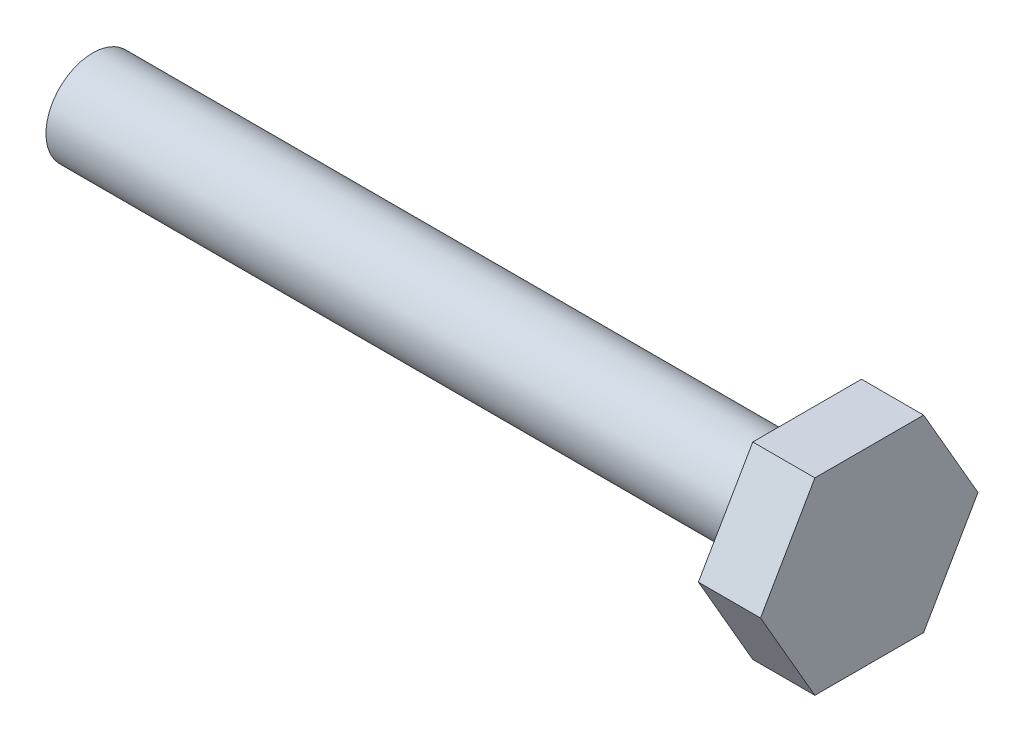
ISO-10303-21;
HEADER;
FILE_DESCRIPTION(('STEP AP214'),'2;1');
FILE_NAME('part.step','',(''),(''),'','','');
FILE_SCHEMA(('AUTOMOTIVE_DESIGN { 1 0 10303 214 1 1 1 1 }'));
ENDSEC;
DATA;
#1=APPLICATION_CONTEXT('core data for automotive mechanical design processes');
#2=APPLICATION_PROTOCOL_DEFINITION('international standard','automotive_design',2000,#1);
#3=PRODUCT_CONTEXT('',#1,'mechanical');
#4=PRODUCT('Part','Part','',(#3));
#5=PRODUCT_RELATED_PRODUCT_CATEGORY('part','',(#4));
#6=PRODUCT_DEFINITION_FORMATION('','',#4);
#7=PRODUCT_DEFINITION_CONTEXT('part definition',#1,'design');
#8=PRODUCT_DEFINITION('design','',#6,#7);
#9=PRODUCT_DEFINITION_SHAPE('','',#8);
#10=(LENGTH_UNIT() NAMED_UNIT(*) SI_UNIT(.MILLI.,.METRE.));
#11=(NAMED_UNIT(*) PLANE_ANGLE_UNIT() SI_UNIT($,.RADIAN.));
#12=(NAMED_UNIT(*) SI_UNIT($,.STERADIAN.) SOLID_ANGLE_UNIT());
#13=UNCERTAINTY_MEASURE_WITH_UNIT(LENGTH_MEASURE(1.E-05),#10,'distance_accuracy_value','');
#14=(GEOMETRIC_REPRESENTATION_CONTEXT(3) GLOBAL_UNCERTAINTY_ASSIGNED_CONTEXT((#13)) GLOBAL_UNIT_ASSIGNED_CONTEXT((#10,
#11,#12)) REPRESENTATION_CONTEXT('',''));
#15=CARTESIAN_POINT('',(0.,0.,0.));
#16=DIRECTION('',(0.,0.,1.));
#17=DIRECTION('',(1.,0.,0.));
#18=AXIS2_PLACEMENT_3D('',#15,#16,#17);
#19=CARTESIAN_POINT('',(0.,7.,0.));
#20=DIRECTION('',(-1.,0.,0.));
#21=DIRECTION('',(0.,-1.,0.));
#22=AXIS2_PLACEMENT_3D('',#19,#20,#21);
#23=PLANE('',#22);
#24=DIRECTION('',(0.,-0.866025403784435,-0.500000000000007));
#25=VECTOR('',#24,1.);
#26=CARTESIAN_POINT('',(0.,-3.03108891324558,5.24999999999997));
#27=LINE('',#26,#25);
#28=CARTESIAN_POINT('',(0.,0.,7.));
#29=VERTEX_POINT('',#28);
#30=CARTESIAN_POINT('',(0.,-6.0621778264911,3.49999999999994));
#31=VERTEX_POINT('',#30);
#32=EDGE_CURVE('E118',#29,#31,#27,.T.);
#33=ORIENTED_EDGE('',*,*,#32,.T.);
#34=DIRECTION('',(0.,0.,-1.));
#35=VECTOR('',#34,1.);
#36=CARTESIAN_POINT('',(0.,-6.06217782649107,0.));
#37=LINE('',#36,#35);
#38=CARTESIAN_POINT('',(0.,-6.06217782649103,-3.50000000000007));
#39=VERTEX_POINT('',#38);
#40=EDGE_CURVE('E128',#31,#39,#37,.T.);
#41=ORIENTED_EDGE('',*,*,#40,.T.);
#42=DIRECTION('',(0.,0.866025403784442,-0.499999999999995));
#43=VECTOR('',#42,1.);
#44=CARTESIAN_POINT('',(0.,-3.03108891324551,-5.25000000000004));
#45=LINE('',#44,#43);
#46=CARTESIAN_POINT('',(0.,0.,-7.));
#47=VERTEX_POINT('',#46);
#48=EDGE_CURVE('E180',#39,#47,#45,.T.);
#49=ORIENTED_EDGE('',*,*,#48,.T.);
#50=DIRECTION('',(0.,0.866025403784438,0.500000000000001));
#51=VECTOR('',#50,1.);
#52=CARTESIAN_POINT('',(0.,3.03108891324554,-5.24999999999999));
#53=LINE('',#52,#51);
#54=CARTESIAN_POINT('',(0.,6.06217782649108,-3.49999999999999));
#55=VERTEX_POINT('',#54);
#56=EDGE_CURVE('E175',#47,#55,#53,.T.);
#57=ORIENTED_EDGE('',*,*,#56,.T.);
#58=DIRECTION('',(0.,0.,1.));
#59=VECTOR('',#58,1.);
#60=CARTESIAN_POINT('',(0.,6.06217782649107,0.));
#61=LINE('',#60,#59);
#62=CARTESIAN_POINT('',(0.,6.06217782649105,3.50000000000003));
#63=VERTEX_POINT('',#62);
#64=EDGE_CURVE('E189',#55,#63,#61,.T.);
#65=ORIENTED_EDGE('',*,*,#64,.T.);
#66=DIRECTION('',(0.,-0.866025403784442,0.499999999999995));
#67=VECTOR('',#66,1.);
#68=CARTESIAN_POINT('',(0.,3.0310889132455,5.25000000000001));
#69=LINE('',#68,#67);
#70=EDGE_CURVE('E136',#63,#29,#69,.T.);
#71=ORIENTED_EDGE('',*,*,#70,.T.);
#72=EDGE_LOOP('',(#33,#41,#49,#57,#65,#71));
#73=FACE_BOUND('',#72,.T.);
#74=ADVANCED_FACE('F63',(#73),#23,.F.);
#75=CARTESIAN_POINT('',(-4.,2.99999999999999,0.));
#76=DIRECTION('',(1.,0.,0.));
#77=DIRECTION('',(0.,1.,0.));
#78=AXIS2_PLACEMENT_3D('',#75,#76,#77);
#79=PLANE('',#78);
#80=CARTESIAN_POINT('',(-4.,0.,0.));
#81=DIRECTION('',(1.,0.,0.));
#82=DIRECTION('',(0.,1.,0.));
#83=AXIS2_PLACEMENT_3D('',#80,#81,#82);
#84=CIRCLE('',#83,2.99999999999999);
#85=CARTESIAN_POINT('',(-4.,2.99999999999999,0.));
#86=VERTEX_POINT('',#85);
#87=EDGE_CURVE('E71',#86,#86,#84,.T.);
#88=ORIENTED_EDGE('',*,*,#87,.T.);
#89=EDGE_LOOP('',(#88));
#90=FACE_BOUND('',#89,.T.);
#91=DIRECTION('',(0.,0.866025403784435,0.500000000000007));
#92=VECTOR('',#91,1.);
#93=CARTESIAN_POINT('',(-4.,-3.03108891324558,5.24999999999997));
#94=LINE('',#93,#92);
#95=CARTESIAN_POINT('',(-4.,-6.06217782649111,3.49999999999994));
#96=VERTEX_POINT('',#95);
#97=CARTESIAN_POINT('',(-4.,0.,7.));
#98=VERTEX_POINT('',#97);
#99=EDGE_CURVE('E121',#96,#98,#94,.T.);
#100=ORIENTED_EDGE('',*,*,#99,.T.);
#101=DIRECTION('',(0.,0.866025403784442,-0.499999999999995));
#102=VECTOR('',#101,1.);
#103=CARTESIAN_POINT('',(-4.,3.0310889132455,5.25000000000001));
#104=LINE('',#103,#102);
#105=CARTESIAN_POINT('',(-4.,6.06217782649105,3.50000000000003));
#106=VERTEX_POINT('',#105);
#107=EDGE_CURVE('E151',#98,#106,#104,.T.);
#108=ORIENTED_EDGE('',*,*,#107,.T.);
#109=DIRECTION('',(0.,0.,-1.));
#110=VECTOR('',#109,1.);
#111=CARTESIAN_POINT('',(-4.,6.06217782649107,0.));
#112=LINE('',#111,#110);
#113=CARTESIAN_POINT('',(-4.,6.06217782649108,-3.49999999999999));
#114=VERTEX_POINT('',#113);
#115=EDGE_CURVE('E86',#106,#114,#112,.T.);
#116=ORIENTED_EDGE('',*,*,#115,.T.);
#117=DIRECTION('',(0.,-0.866025403784438,-0.500000000000001));
#118=VECTOR('',#117,1.);
#119=CARTESIAN_POINT('',(-4.,3.03108891324554,-5.24999999999999));
#120=LINE('',#119,#118);
#121=CARTESIAN_POINT('',(-4.,0.,-7.));
#122=VERTEX_POINT('',#121);
#123=EDGE_CURVE('E167',#114,#122,#120,.T.);
#124=ORIENTED_EDGE('',*,*,#123,.T.);
#125=DIRECTION('',(0.,-0.866025403784442,0.499999999999995));
#126=VECTOR('',#125,1.);
#127=CARTESIAN_POINT('',(-4.,-3.03108891324552,-5.25000000000004));
#128=LINE('',#127,#126);
#129=CARTESIAN_POINT('',(-4.,-6.06217782649103,-3.50000000000007));
#130=VERTEX_POINT('',#129);
#131=EDGE_CURVE('E78',#122,#130,#128,.T.);
#132=ORIENTED_EDGE('',*,*,#131,.T.);
#133=DIRECTION('',(0.,0.,1.));
#134=VECTOR('',#133,1.);
#135=CARTESIAN_POINT('',(-4.,-6.06217782649107,0.));
#136=LINE('',#135,#134);
#137=EDGE_CURVE('E127',#130,#96,#136,.T.);
#138=ORIENTED_EDGE('',*,*,#137,.T.);
#139=EDGE_LOOP('',(#100,#108,#116,#124,#132,#138));
#140=FACE_BOUND('',#139,.T.);
#141=ADVANCED_FACE('F197',(#90,#140),#79,.F.);
#142=CARTESIAN_POINT('',(-50.,0.,0.));
#143=DIRECTION('',(1.,0.,0.));
#144=DIRECTION('',(0.,1.,0.));
#145=AXIS2_PLACEMENT_3D('',#142,#143,#144);
#146=PLANE('',#145);
#147=CARTESIAN_POINT('',(-50.,0.,0.));
#148=DIRECTION('',(1.,0.,0.));
#149=DIRECTION('',(0.,1.,0.));
#150=AXIS2_PLACEMENT_3D('',#147,#148,#149);
#151=CIRCLE('',#150,3.);
#152=CARTESIAN_POINT('',(-50.,2.99999999999999,0.));
#153=VERTEX_POINT('',#152);
#154=EDGE_CURVE('E12',#153,#153,#151,.T.);
#155=ORIENTED_EDGE('',*,*,#154,.F.);
#156=EDGE_LOOP('',(#155));
#157=FACE_BOUND('',#156,.T.);
#158=ADVANCED_FACE('F213',(#157),#146,.F.);
#159=CARTESIAN_POINT('',(0.,0.,0.));
#160=DIRECTION('',(1.,0.,0.));
#161=DIRECTION('',(0.,1.,0.));
#162=AXIS2_PLACEMENT_3D('',#159,#160,#161);
#163=CYLINDRICAL_SURFACE('',#162,3.);
#164=ORIENTED_EDGE('',*,*,#87,.F.);
#165=EDGE_LOOP('',(#164));
#166=FACE_BOUND('',#165,.T.);
#167=ORIENTED_EDGE('',*,*,#154,.T.);
#168=EDGE_LOOP('',(#167));
#169=FACE_BOUND('',#168,.T.);
#170=ADVANCED_FACE('F218',(#166,#169),#163,.T.);
#171=CARTESIAN_POINT('',(-11.0625427736139,-6.06217782649107,0.));
#172=DIRECTION('',(0.,-1.,0.));
#173=DIRECTION('',(0.,0.,-1.));
#174=AXIS2_PLACEMENT_3D('',#171,#172,#173);
#175=PLANE('',#174);
#176=DIRECTION('',(1.,0.,0.));
#177=VECTOR('',#176,1.);
#178=CARTESIAN_POINT('',(-11.0625427736139,-6.06217782649103,-3.50000000000007));
#179=LINE('',#178,#177);
#180=EDGE_CURVE('E141',#130,#39,#179,.T.);
#181=ORIENTED_EDGE('',*,*,#180,.T.);
#182=ORIENTED_EDGE('',*,*,#40,.F.);
#183=DIRECTION('',(1.,0.,0.));
#184=VECTOR('',#183,1.);
#185=CARTESIAN_POINT('',(-11.0625427736139,-6.06217782649111,3.49999999999994));
#186=LINE('',#185,#184);
#187=EDGE_CURVE('E115',#96,#31,#186,.T.);
#188=ORIENTED_EDGE('',*,*,#187,.F.);
#189=ORIENTED_EDGE('',*,*,#137,.F.);
#190=EDGE_LOOP('',(#181,#182,#188,#189));
#191=FACE_BOUND('',#190,.T.);
#192=ADVANCED_FACE('F140',(#191),#175,.T.);
#193=CARTESIAN_POINT('',(-11.0625427736139,3.03108891324554,-5.24999999999999));
#194=DIRECTION('',(0.,0.500000000000001,-0.866025403784438));
#195=DIRECTION('',(0.,0.866025403784438,0.500000000000001));
#196=AXIS2_PLACEMENT_3D('',#193,#194,#195);
#197=PLANE('',#196);
#198=DIRECTION('',(1.,0.,0.));
#199=VECTOR('',#198,1.);
#200=CARTESIAN_POINT('',(-11.0625427736139,6.06217782649108,-3.49999999999999));
#201=LINE('',#200,#199);
#202=EDGE_CURVE('E145',#114,#55,#201,.T.);
#203=ORIENTED_EDGE('',*,*,#202,.T.);
#204=ORIENTED_EDGE('',*,*,#56,.F.);
#205=DIRECTION('',(1.,0.,0.));
#206=VECTOR('',#205,1.);
#207=CARTESIAN_POINT('',(-11.0625427736139,0.,-7.));
#208=LINE('',#207,#206);
#209=EDGE_CURVE('E174',#122,#47,#208,.T.);
#210=ORIENTED_EDGE('',*,*,#209,.F.);
#211=ORIENTED_EDGE('',*,*,#123,.F.);
#212=EDGE_LOOP('',(#203,#204,#210,#211));
#213=FACE_BOUND('',#212,.T.);
#214=ADVANCED_FACE('F187',(#213),#197,.T.);
#215=CARTESIAN_POINT('',(-11.0625427736139,3.0310889132455,5.25000000000001));
#216=DIRECTION('',(0.,0.499999999999995,0.866025403784441));
#217=DIRECTION('',(0.,-0.866025403784442,0.499999999999995));
#218=AXIS2_PLACEMENT_3D('',#215,#216,#217);
#219=PLANE('',#218);
#220=DIRECTION('',(1.,0.,0.));
#221=VECTOR('',#220,1.);
#222=CARTESIAN_POINT('',(-11.0625427736139,0.,7.));
#223=LINE('',#222,#221);
#224=EDGE_CURVE('E156',#98,#29,#223,.T.);
#225=ORIENTED_EDGE('',*,*,#224,.T.);
#226=ORIENTED_EDGE('',*,*,#70,.F.);
#227=DIRECTION('',(1.,0.,0.));
#228=VECTOR('',#227,1.);
#229=CARTESIAN_POINT('',(-11.0625427736139,6.06217782649105,3.50000000000003));
#230=LINE('',#229,#228);
#231=EDGE_CURVE('E161',#106,#63,#230,.T.);
#232=ORIENTED_EDGE('',*,*,#231,.F.);
#233=ORIENTED_EDGE('',*,*,#107,.F.);
#234=EDGE_LOOP('',(#225,#226,#232,#233));
#235=FACE_BOUND('',#234,.T.);
#236=ADVANCED_FACE('F199',(#235),#219,.T.);
#237=CARTESIAN_POINT('',(-11.0625427736139,6.06217782649107,0.));
#238=DIRECTION('',(0.,1.,0.));
#239=DIRECTION('',(0.,0.,1.));
#240=AXIS2_PLACEMENT_3D('',#237,#238,#239);
#241=PLANE('',#240);
#242=ORIENTED_EDGE('',*,*,#231,.T.);
#243=ORIENTED_EDGE('',*,*,#64,.F.);
#244=ORIENTED_EDGE('',*,*,#202,.F.);
#245=ORIENTED_EDGE('',*,*,#115,.F.);
#246=EDGE_LOOP('',(#242,#243,#244,#245));
#247=FACE_BOUND('',#246,.T.);
#248=ADVANCED_FACE('F200',(#247),#241,.T.);
#249=CARTESIAN_POINT('',(-11.0625427736139,-3.03108891324552,-5.25000000000004));
#250=DIRECTION('',(0.,-0.499999999999995,-0.866025403784441));
#251=DIRECTION('',(0.,0.866025403784442,-0.499999999999995));
#252=AXIS2_PLACEMENT_3D('',#249,#250,#251);
#253=PLANE('',#252);
#254=ORIENTED_EDGE('',*,*,#209,.T.);
#255=ORIENTED_EDGE('',*,*,#48,.F.);
#256=ORIENTED_EDGE('',*,*,#180,.F.);
#257=ORIENTED_EDGE('',*,*,#131,.F.);
#258=EDGE_LOOP('',(#254,#255,#256,#257));
#259=FACE_BOUND('',#258,.T.);
#260=ADVANCED_FACE('F179',(#259),#253,.T.);
#261=CARTESIAN_POINT('',(-11.0625427736139,-3.03108891324558,5.24999999999997));
#262=DIRECTION('',(0.,-0.500000000000007,0.866025403784435));
#263=DIRECTION('',(0.,-0.866025403784435,-0.500000000000007));
#264=AXIS2_PLACEMENT_3D('',#261,#262,#263);
#265=PLANE('',#264);
#266=ORIENTED_EDGE('',*,*,#187,.T.);
#267=ORIENTED_EDGE('',*,*,#32,.F.);
#268=ORIENTED_EDGE('',*,*,#224,.F.);
#269=ORIENTED_EDGE('',*,*,#99,.F.);
#270=EDGE_LOOP('',(#266,#267,#268,#269));
#271=FACE_BOUND('',#270,.T.);
#272=ADVANCED_FACE('F117',(#271),#265,.T.);
#273=CLOSED_SHELL('',(#74,#141,#158,#170,#192,#214,#236,#248,#260,#272));
#274=MANIFOLD_SOLID_BREP('B2',#273);
#275=ADVANCED_BREP_SHAPE_REPRESENTATION('',(#18,#274),#14);
#276=SHAPE_DEFINITION_REPRESENTATION(#9,#275);
ENDSEC;
END-ISO-10303-21;
